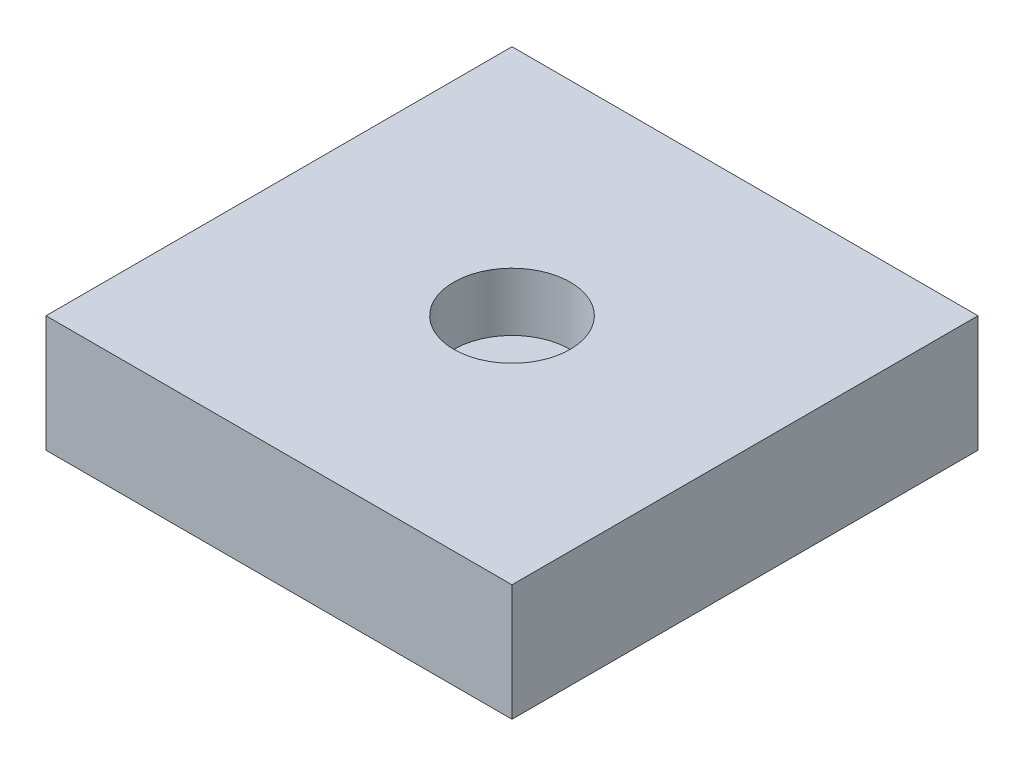
ISO-10303-21;
HEADER;
FILE_DESCRIPTION(('STEP AP214'),'2;1');
FILE_NAME('part.step','',(''),(''),'','','');
FILE_SCHEMA(('AUTOMOTIVE_DESIGN { 1 0 10303 214 1 1 1 1 }'));
ENDSEC;
DATA;
#1=APPLICATION_CONTEXT('core data for automotive mechanical design processes');
#2=APPLICATION_PROTOCOL_DEFINITION('international standard','automotive_design',2000,#1);
#3=PRODUCT_CONTEXT('',#1,'mechanical');
#4=PRODUCT('Part','Part','',(#3));
#5=PRODUCT_RELATED_PRODUCT_CATEGORY('part','',(#4));
#6=PRODUCT_DEFINITION_FORMATION('','',#4);
#7=PRODUCT_DEFINITION_CONTEXT('part definition',#1,'design');
#8=PRODUCT_DEFINITION('design','',#6,#7);
#9=PRODUCT_DEFINITION_SHAPE('','',#8);
#10=(LENGTH_UNIT() NAMED_UNIT(*) SI_UNIT(.MILLI.,.METRE.));
#11=(NAMED_UNIT(*) PLANE_ANGLE_UNIT() SI_UNIT($,.RADIAN.));
#12=(NAMED_UNIT(*) SI_UNIT($,.STERADIAN.) SOLID_ANGLE_UNIT());
#13=UNCERTAINTY_MEASURE_WITH_UNIT(LENGTH_MEASURE(1.E-05),#10,'distance_accuracy_value','');
#14=(GEOMETRIC_REPRESENTATION_CONTEXT(3) GLOBAL_UNCERTAINTY_ASSIGNED_CONTEXT((#13)) GLOBAL_UNIT_ASSIGNED_CONTEXT((#10,
#11,#12)) REPRESENTATION_CONTEXT('',''));
#15=CARTESIAN_POINT('',(0.,0.,0.));
#16=DIRECTION('',(0.,0.,1.));
#17=DIRECTION('',(1.,0.,0.));
#18=AXIS2_PLACEMENT_3D('',#15,#16,#17);
#19=CARTESIAN_POINT('',(25.4,12.7,25.4));
#20=DIRECTION('',(-1.,0.,0.));
#21=DIRECTION('',(0.,0.,1.));
#22=AXIS2_PLACEMENT_3D('',#19,#20,#21);
#23=PLANE('',#22);
#24=DIRECTION('',(0.,0.,-1.));
#25=VECTOR('',#24,1.);
#26=CARTESIAN_POINT('',(25.4,0.,25.4));
#27=LINE('',#26,#25);
#28=CARTESIAN_POINT('',(25.4,0.,25.4));
#29=VERTEX_POINT('',#28);
#30=CARTESIAN_POINT('',(25.4,0.,-25.4));
#31=VERTEX_POINT('',#30);
#32=EDGE_CURVE('E100',#29,#31,#27,.T.);
#33=ORIENTED_EDGE('',*,*,#32,.T.);
#34=DIRECTION('',(0.,-1.,0.));
#35=VECTOR('',#34,1.);
#36=CARTESIAN_POINT('',(25.4,12.7,-25.4));
#37=LINE('',#36,#35);
#38=CARTESIAN_POINT('',(25.4,12.7,-25.4));
#39=VERTEX_POINT('',#38);
#40=EDGE_CURVE('E11',#39,#31,#37,.T.);
#41=ORIENTED_EDGE('',*,*,#40,.F.);
#42=DIRECTION('',(0.,0.,-1.));
#43=VECTOR('',#42,1.);
#44=CARTESIAN_POINT('',(25.4,12.7,25.4));
#45=LINE('',#44,#43);
#46=CARTESIAN_POINT('',(25.4,12.7,25.4));
#47=VERTEX_POINT('',#46);
#48=EDGE_CURVE('E88',#47,#39,#45,.T.);
#49=ORIENTED_EDGE('',*,*,#48,.F.);
#50=DIRECTION('',(0.,-1.,0.));
#51=VECTOR('',#50,1.);
#52=CARTESIAN_POINT('',(25.4,12.7,25.4));
#53=LINE('',#52,#51);
#54=EDGE_CURVE('E96',#47,#29,#53,.T.);
#55=ORIENTED_EDGE('',*,*,#54,.T.);
#56=EDGE_LOOP('',(#33,#41,#49,#55));
#57=FACE_BOUND('',#56,.T.);
#58=ADVANCED_FACE('F37',(#57),#23,.F.);
#59=CARTESIAN_POINT('',(-25.4,12.7,-25.4));
#60=DIRECTION('',(0.,0.,1.));
#61=DIRECTION('',(1.,0.,0.));
#62=AXIS2_PLACEMENT_3D('',#59,#60,#61);
#63=PLANE('',#62);
#64=DIRECTION('',(-1.,0.,0.));
#65=VECTOR('',#64,1.);
#66=CARTESIAN_POINT('',(-25.4,0.,-25.4));
#67=LINE('',#66,#65);
#68=CARTESIAN_POINT('',(-25.4,0.,-25.4));
#69=VERTEX_POINT('',#68);
#70=EDGE_CURVE('E92',#31,#69,#67,.T.);
#71=ORIENTED_EDGE('',*,*,#70,.T.);
#72=DIRECTION('',(0.,-1.,0.));
#73=VECTOR('',#72,1.);
#74=CARTESIAN_POINT('',(-25.4,12.7,-25.4));
#75=LINE('',#74,#73);
#76=CARTESIAN_POINT('',(-25.4,12.7,-25.4));
#77=VERTEX_POINT('',#76);
#78=EDGE_CURVE('E45',#77,#69,#75,.T.);
#79=ORIENTED_EDGE('',*,*,#78,.F.);
#80=DIRECTION('',(-1.,0.,0.));
#81=VECTOR('',#80,1.);
#82=CARTESIAN_POINT('',(-25.4,12.7,-25.4));
#83=LINE('',#82,#81);
#84=EDGE_CURVE('E83',#39,#77,#83,.T.);
#85=ORIENTED_EDGE('',*,*,#84,.F.);
#86=ORIENTED_EDGE('',*,*,#40,.T.);
#87=EDGE_LOOP('',(#71,#79,#85,#86));
#88=FACE_BOUND('',#87,.T.);
#89=ADVANCED_FACE('F91',(#88),#63,.F.);
#90=CARTESIAN_POINT('',(-25.4,12.7,25.4));
#91=DIRECTION('',(1.,0.,0.));
#92=DIRECTION('',(0.,0.,-1.));
#93=AXIS2_PLACEMENT_3D('',#90,#91,#92);
#94=PLANE('',#93);
#95=DIRECTION('',(0.,0.,1.));
#96=VECTOR('',#95,1.);
#97=CARTESIAN_POINT('',(-25.4,0.,25.4));
#98=LINE('',#97,#96);
#99=CARTESIAN_POINT('',(-25.4,0.,25.4));
#100=VERTEX_POINT('',#99);
#101=EDGE_CURVE('E70',#69,#100,#98,.T.);
#102=ORIENTED_EDGE('',*,*,#101,.T.);
#103=DIRECTION('',(0.,-1.,0.));
#104=VECTOR('',#103,1.);
#105=CARTESIAN_POINT('',(-25.4,12.7,25.4));
#106=LINE('',#105,#104);
#107=CARTESIAN_POINT('',(-25.4,12.7,25.4));
#108=VERTEX_POINT('',#107);
#109=EDGE_CURVE('E93',#108,#100,#106,.T.);
#110=ORIENTED_EDGE('',*,*,#109,.F.);
#111=DIRECTION('',(0.,0.,1.));
#112=VECTOR('',#111,1.);
#113=CARTESIAN_POINT('',(-25.4,12.7,25.4));
#114=LINE('',#113,#112);
#115=EDGE_CURVE('E86',#77,#108,#114,.T.);
#116=ORIENTED_EDGE('',*,*,#115,.F.);
#117=ORIENTED_EDGE('',*,*,#78,.T.);
#118=EDGE_LOOP('',(#102,#110,#116,#117));
#119=FACE_BOUND('',#118,.T.);
#120=ADVANCED_FACE('F94',(#119),#94,.F.);
#121=CARTESIAN_POINT('',(-25.4,12.7,25.4));
#122=DIRECTION('',(0.,0.,-1.));
#123=DIRECTION('',(-1.,0.,0.));
#124=AXIS2_PLACEMENT_3D('',#121,#122,#123);
#125=PLANE('',#124);
#126=DIRECTION('',(1.,0.,0.));
#127=VECTOR('',#126,1.);
#128=CARTESIAN_POINT('',(-25.4,0.,25.4));
#129=LINE('',#128,#127);
#130=EDGE_CURVE('E76',#100,#29,#129,.T.);
#131=ORIENTED_EDGE('',*,*,#130,.T.);
#132=ORIENTED_EDGE('',*,*,#54,.F.);
#133=DIRECTION('',(1.,0.,0.));
#134=VECTOR('',#133,1.);
#135=CARTESIAN_POINT('',(-25.4,12.7,25.4));
#136=LINE('',#135,#134);
#137=EDGE_CURVE('E53',#108,#47,#136,.T.);
#138=ORIENTED_EDGE('',*,*,#137,.F.);
#139=ORIENTED_EDGE('',*,*,#109,.T.);
#140=EDGE_LOOP('',(#131,#132,#138,#139));
#141=FACE_BOUND('',#140,.T.);
#142=ADVANCED_FACE('F108',(#141),#125,.F.);
#143=CARTESIAN_POINT('',(0.,12.7,0.));
#144=DIRECTION('',(0.,-1.,0.));
#145=DIRECTION('',(0.,0.,-1.));
#146=AXIS2_PLACEMENT_3D('',#143,#144,#145);
#147=PLANE('',#146);
#148=CARTESIAN_POINT('',(0.,12.7,0.));
#149=DIRECTION('',(0.,1.,0.));
#150=DIRECTION('',(0.,0.,1.));
#151=AXIS2_PLACEMENT_3D('',#148,#149,#150);
#152=CIRCLE('',#151,6.35);
#153=CARTESIAN_POINT('',(0.,12.7,6.35));
#154=VERTEX_POINT('',#153);
#155=EDGE_CURVE('E114',#154,#154,#152,.T.);
#156=ORIENTED_EDGE('',*,*,#155,.F.);
#157=EDGE_LOOP('',(#156));
#158=FACE_BOUND('',#157,.T.);
#159=ORIENTED_EDGE('',*,*,#48,.T.);
#160=ORIENTED_EDGE('',*,*,#84,.T.);
#161=ORIENTED_EDGE('',*,*,#115,.T.);
#162=ORIENTED_EDGE('',*,*,#137,.T.);
#163=EDGE_LOOP('',(#159,#160,#161,#162));
#164=FACE_BOUND('',#163,.T.);
#165=ADVANCED_FACE('F84',(#158,#164),#147,.F.);
#166=CARTESIAN_POINT('',(0.,0.,0.));
#167=DIRECTION('',(0.,-1.,0.));
#168=DIRECTION('',(0.,0.,-1.));
#169=AXIS2_PLACEMENT_3D('',#166,#167,#168);
#170=PLANE('',#169);
#171=ORIENTED_EDGE('',*,*,#32,.F.);
#172=ORIENTED_EDGE('',*,*,#130,.F.);
#173=ORIENTED_EDGE('',*,*,#101,.F.);
#174=ORIENTED_EDGE('',*,*,#70,.F.);
#175=EDGE_LOOP('',(#171,#172,#173,#174));
#176=FACE_BOUND('',#175,.T.);
#177=ADVANCED_FACE('F111',(#176),#170,.T.);
#178=CARTESIAN_POINT('',(0.,6.35,0.));
#179=DIRECTION('',(0.,1.,0.));
#180=DIRECTION('',(0.,0.,1.));
#181=AXIS2_PLACEMENT_3D('',#178,#179,#180);
#182=CYLINDRICAL_SURFACE('',#181,6.35);
#183=CARTESIAN_POINT('',(0.,6.35,0.));
#184=DIRECTION('',(0.,1.,0.));
#185=DIRECTION('',(0.,0.,1.));
#186=AXIS2_PLACEMENT_3D('',#183,#184,#185);
#187=CIRCLE('',#186,6.35);
#188=CARTESIAN_POINT('',(0.,6.35,6.35));
#189=VERTEX_POINT('',#188);
#190=EDGE_CURVE('E103',#189,#189,#187,.T.);
#191=ORIENTED_EDGE('',*,*,#190,.F.);
#192=EDGE_LOOP('',(#191));
#193=FACE_BOUND('',#192,.T.);
#194=ORIENTED_EDGE('',*,*,#155,.T.);
#195=EDGE_LOOP('',(#194));
#196=FACE_BOUND('',#195,.T.);
#197=ADVANCED_FACE('F122',(#193,#196),#182,.F.);
#198=CARTESIAN_POINT('',(0.,6.35,0.));
#199=DIRECTION('',(0.,1.,0.));
#200=DIRECTION('',(0.,0.,1.));
#201=AXIS2_PLACEMENT_3D('',#198,#199,#200);
#202=PLANE('',#201);
#203=ORIENTED_EDGE('',*,*,#190,.T.);
#204=EDGE_LOOP('',(#203));
#205=FACE_BOUND('',#204,.T.);
#206=ADVANCED_FACE('F120',(#205),#202,.T.);
#207=CLOSED_SHELL('',(#58,#89,#120,#142,#165,#177,#197,#206));
#208=MANIFOLD_SOLID_BREP('B2',#207);
#209=ADVANCED_BREP_SHAPE_REPRESENTATION('',(#18,#208),#14);
#210=SHAPE_DEFINITION_REPRESENTATION(#9,#209);
ENDSEC;
END-ISO-10303-21;
